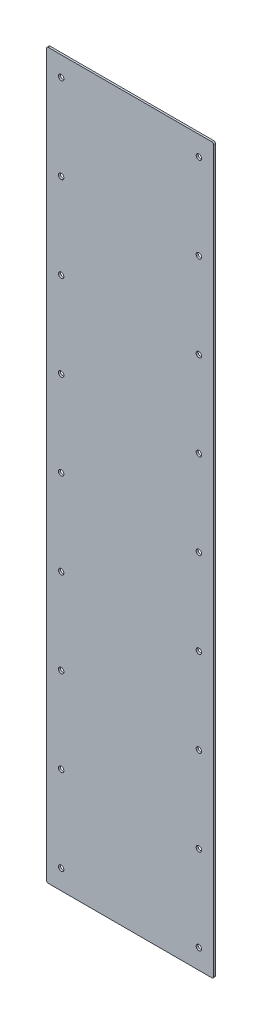
ISO-10303-21;
HEADER;
FILE_DESCRIPTION(('STEP AP214'),'2;1');
FILE_NAME('part.step','',(''),(''),'','','');
FILE_SCHEMA(('AUTOMOTIVE_DESIGN { 1 0 10303 214 1 1 1 1 }'));
ENDSEC;
DATA;
#1=APPLICATION_CONTEXT('core data for automotive mechanical design processes');
#2=APPLICATION_PROTOCOL_DEFINITION('international standard','automotive_design',2000,#1);
#3=PRODUCT_CONTEXT('',#1,'mechanical');
#4=PRODUCT('Part','Part','',(#3));
#5=PRODUCT_RELATED_PRODUCT_CATEGORY('part','',(#4));
#6=PRODUCT_DEFINITION_FORMATION('','',#4);
#7=PRODUCT_DEFINITION_CONTEXT('part definition',#1,'design');
#8=PRODUCT_DEFINITION('design','',#6,#7);
#9=PRODUCT_DEFINITION_SHAPE('','',#8);
#10=(LENGTH_UNIT() NAMED_UNIT(*) SI_UNIT(.MILLI.,.METRE.));
#11=(NAMED_UNIT(*) PLANE_ANGLE_UNIT() SI_UNIT($,.RADIAN.));
#12=(NAMED_UNIT(*) SI_UNIT($,.STERADIAN.) SOLID_ANGLE_UNIT());
#13=UNCERTAINTY_MEASURE_WITH_UNIT(LENGTH_MEASURE(1.E-05),#10,'distance_accuracy_value','');
#14=(GEOMETRIC_REPRESENTATION_CONTEXT(3) GLOBAL_UNCERTAINTY_ASSIGNED_CONTEXT((#13)) GLOBAL_UNIT_ASSIGNED_CONTEXT((#10,
#11,#12)) REPRESENTATION_CONTEXT('',''));
#15=CARTESIAN_POINT('',(0.,0.,0.));
#16=DIRECTION('',(0.,0.,1.));
#17=DIRECTION('',(1.,0.,0.));
#18=AXIS2_PLACEMENT_3D('',#15,#16,#17);
#19=CARTESIAN_POINT('',(0.,0.,-2.));
#20=DIRECTION('',(0.,0.,1.));
#21=DIRECTION('',(1.,0.,0.));
#22=AXIS2_PLACEMENT_3D('',#19,#20,#21);
#23=PLANE('',#22);
#24=CARTESIAN_POINT('',(-70.,-261.,-2.));
#25=DIRECTION('',(0.,0.,1.));
#26=DIRECTION('',(1.,0.,0.));
#27=AXIS2_PLACEMENT_3D('',#24,#25,#26);
#28=CIRCLE('',#27,2.74999999999999);
#29=CARTESIAN_POINT('',(-67.2500000000001,-261.,-2.));
#30=VERTEX_POINT('',#29);
#31=EDGE_CURVE('E292',#30,#30,#28,.T.);
#32=ORIENTED_EDGE('',*,*,#31,.T.);
#33=EDGE_LOOP('',(#32));
#34=FACE_BOUND('',#33,.T.);
#35=CARTESIAN_POINT('',(-70.0000000000001,-174.,-2.));
#36=DIRECTION('',(0.,0.,1.));
#37=DIRECTION('',(1.,0.,0.));
#38=AXIS2_PLACEMENT_3D('',#35,#36,#37);
#39=CIRCLE('',#38,2.74999999999999);
#40=CARTESIAN_POINT('',(-67.2500000000001,-174.,-2.));
#41=VERTEX_POINT('',#40);
#42=EDGE_CURVE('E286',#41,#41,#39,.T.);
#43=ORIENTED_EDGE('',*,*,#42,.T.);
#44=EDGE_LOOP('',(#43));
#45=FACE_BOUND('',#44,.T.);
#46=CARTESIAN_POINT('',(-70.0000000000001,-87.,-2.));
#47=DIRECTION('',(0.,0.,1.));
#48=DIRECTION('',(1.,0.,0.));
#49=AXIS2_PLACEMENT_3D('',#46,#47,#48);
#50=CIRCLE('',#49,2.74999999999999);
#51=CARTESIAN_POINT('',(-67.2500000000001,-87.,-2.));
#52=VERTEX_POINT('',#51);
#53=EDGE_CURVE('E280',#52,#52,#50,.T.);
#54=ORIENTED_EDGE('',*,*,#53,.T.);
#55=EDGE_LOOP('',(#54));
#56=FACE_BOUND('',#55,.T.);
#57=CARTESIAN_POINT('',(-70.0000000000001,0.,-2.));
#58=DIRECTION('',(0.,0.,1.));
#59=DIRECTION('',(1.,0.,0.));
#60=AXIS2_PLACEMENT_3D('',#57,#58,#59);
#61=CIRCLE('',#60,2.74999999999999);
#62=CARTESIAN_POINT('',(-67.2500000000001,0.,-2.));
#63=VERTEX_POINT('',#62);
#64=EDGE_CURVE('E274',#63,#63,#61,.T.);
#65=ORIENTED_EDGE('',*,*,#64,.T.);
#66=EDGE_LOOP('',(#65));
#67=FACE_BOUND('',#66,.T.);
#68=CARTESIAN_POINT('',(-70.0000000000001,87.,-2.));
#69=DIRECTION('',(0.,0.,1.));
#70=DIRECTION('',(1.,0.,0.));
#71=AXIS2_PLACEMENT_3D('',#68,#69,#70);
#72=CIRCLE('',#71,2.74999999999999);
#73=CARTESIAN_POINT('',(-67.2500000000001,87.,-2.));
#74=VERTEX_POINT('',#73);
#75=EDGE_CURVE('E268',#74,#74,#72,.T.);
#76=ORIENTED_EDGE('',*,*,#75,.T.);
#77=EDGE_LOOP('',(#76));
#78=FACE_BOUND('',#77,.T.);
#79=CARTESIAN_POINT('',(-70.0000000000001,174.,-2.));
#80=DIRECTION('',(0.,0.,1.));
#81=DIRECTION('',(1.,0.,0.));
#82=AXIS2_PLACEMENT_3D('',#79,#80,#81);
#83=CIRCLE('',#82,2.74999999999999);
#84=CARTESIAN_POINT('',(-67.2500000000001,174.,-2.));
#85=VERTEX_POINT('',#84);
#86=EDGE_CURVE('E262',#85,#85,#83,.T.);
#87=ORIENTED_EDGE('',*,*,#86,.T.);
#88=EDGE_LOOP('',(#87));
#89=FACE_BOUND('',#88,.T.);
#90=CARTESIAN_POINT('',(-70.0000000000001,261.,-2.));
#91=DIRECTION('',(0.,0.,1.));
#92=DIRECTION('',(1.,0.,0.));
#93=AXIS2_PLACEMENT_3D('',#90,#91,#92);
#94=CIRCLE('',#93,2.74999999999999);
#95=CARTESIAN_POINT('',(-67.2500000000001,261.,-2.));
#96=VERTEX_POINT('',#95);
#97=EDGE_CURVE('E255',#96,#96,#94,.T.);
#98=ORIENTED_EDGE('',*,*,#97,.T.);
#99=EDGE_LOOP('',(#98));
#100=FACE_BOUND('',#99,.T.);
#101=CARTESIAN_POINT('',(-70.0000000000001,348.,-2.));
#102=DIRECTION('',(0.,0.,1.));
#103=DIRECTION('',(1.,0.,0.));
#104=AXIS2_PLACEMENT_3D('',#101,#102,#103);
#105=CIRCLE('',#104,2.74999999999999);
#106=CARTESIAN_POINT('',(-67.2500000000001,348.,-2.));
#107=VERTEX_POINT('',#106);
#108=EDGE_CURVE('E256',#107,#107,#105,.T.);
#109=ORIENTED_EDGE('',*,*,#108,.T.);
#110=EDGE_LOOP('',(#109));
#111=FACE_BOUND('',#110,.T.);
#112=CARTESIAN_POINT('',(70.,-261.,-2.));
#113=DIRECTION('',(0.,0.,-1.));
#114=DIRECTION('',(-1.,0.,0.));
#115=AXIS2_PLACEMENT_3D('',#112,#113,#114);
#116=CIRCLE('',#115,2.74999999999999);
#117=CARTESIAN_POINT('',(67.2500000000001,-261.,-2.));
#118=VERTEX_POINT('',#117);
#119=EDGE_CURVE('E239',#118,#118,#116,.T.);
#120=ORIENTED_EDGE('',*,*,#119,.F.);
#121=EDGE_LOOP('',(#120));
#122=FACE_BOUND('',#121,.T.);
#123=CARTESIAN_POINT('',(70.0000000000001,-174.,-2.));
#124=DIRECTION('',(0.,0.,-1.));
#125=DIRECTION('',(-1.,0.,0.));
#126=AXIS2_PLACEMENT_3D('',#123,#124,#125);
#127=CIRCLE('',#126,2.74999999999999);
#128=CARTESIAN_POINT('',(67.2500000000001,-174.,-2.));
#129=VERTEX_POINT('',#128);
#130=EDGE_CURVE('E233',#129,#129,#127,.T.);
#131=ORIENTED_EDGE('',*,*,#130,.F.);
#132=EDGE_LOOP('',(#131));
#133=FACE_BOUND('',#132,.T.);
#134=CARTESIAN_POINT('',(70.0000000000001,-87.,-2.));
#135=DIRECTION('',(0.,0.,-1.));
#136=DIRECTION('',(-1.,0.,0.));
#137=AXIS2_PLACEMENT_3D('',#134,#135,#136);
#138=CIRCLE('',#137,2.74999999999999);
#139=CARTESIAN_POINT('',(67.2500000000001,-87.,-2.));
#140=VERTEX_POINT('',#139);
#141=EDGE_CURVE('E227',#140,#140,#138,.T.);
#142=ORIENTED_EDGE('',*,*,#141,.F.);
#143=EDGE_LOOP('',(#142));
#144=FACE_BOUND('',#143,.T.);
#145=CARTESIAN_POINT('',(70.0000000000001,0.,-2.));
#146=DIRECTION('',(0.,0.,-1.));
#147=DIRECTION('',(-1.,0.,0.));
#148=AXIS2_PLACEMENT_3D('',#145,#146,#147);
#149=CIRCLE('',#148,2.74999999999999);
#150=CARTESIAN_POINT('',(67.2500000000001,0.,-2.));
#151=VERTEX_POINT('',#150);
#152=EDGE_CURVE('E221',#151,#151,#149,.T.);
#153=ORIENTED_EDGE('',*,*,#152,.F.);
#154=EDGE_LOOP('',(#153));
#155=FACE_BOUND('',#154,.T.);
#156=CARTESIAN_POINT('',(70.0000000000001,87.,-2.));
#157=DIRECTION('',(0.,0.,-1.));
#158=DIRECTION('',(-1.,0.,0.));
#159=AXIS2_PLACEMENT_3D('',#156,#157,#158);
#160=CIRCLE('',#159,2.74999999999999);
#161=CARTESIAN_POINT('',(67.2500000000001,87.,-2.));
#162=VERTEX_POINT('',#161);
#163=EDGE_CURVE('E215',#162,#162,#160,.T.);
#164=ORIENTED_EDGE('',*,*,#163,.F.);
#165=EDGE_LOOP('',(#164));
#166=FACE_BOUND('',#165,.T.);
#167=CARTESIAN_POINT('',(70.0000000000001,174.,-2.));
#168=DIRECTION('',(0.,0.,-1.));
#169=DIRECTION('',(-1.,0.,0.));
#170=AXIS2_PLACEMENT_3D('',#167,#168,#169);
#171=CIRCLE('',#170,2.74999999999999);
#172=CARTESIAN_POINT('',(67.2500000000001,174.,-2.));
#173=VERTEX_POINT('',#172);
#174=EDGE_CURVE('E209',#173,#173,#171,.T.);
#175=ORIENTED_EDGE('',*,*,#174,.F.);
#176=EDGE_LOOP('',(#175));
#177=FACE_BOUND('',#176,.T.);
#178=CARTESIAN_POINT('',(70.0000000000001,261.,-2.));
#179=DIRECTION('',(0.,0.,-1.));
#180=DIRECTION('',(-1.,0.,0.));
#181=AXIS2_PLACEMENT_3D('',#178,#179,#180);
#182=CIRCLE('',#181,2.74999999999999);
#183=CARTESIAN_POINT('',(67.2500000000001,261.,-2.));
#184=VERTEX_POINT('',#183);
#185=EDGE_CURVE('E201',#184,#184,#182,.T.);
#186=ORIENTED_EDGE('',*,*,#185,.F.);
#187=EDGE_LOOP('',(#186));
#188=FACE_BOUND('',#187,.T.);
#189=CARTESIAN_POINT('',(70.0000000000001,348.,-2.));
#190=DIRECTION('',(0.,0.,-1.));
#191=DIRECTION('',(-1.,0.,0.));
#192=AXIS2_PLACEMENT_3D('',#189,#190,#191);
#193=CIRCLE('',#192,2.74999999999999);
#194=CARTESIAN_POINT('',(67.2500000000001,348.,-2.));
#195=VERTEX_POINT('',#194);
#196=EDGE_CURVE('E202',#195,#195,#193,.T.);
#197=ORIENTED_EDGE('',*,*,#196,.F.);
#198=EDGE_LOOP('',(#197));
#199=FACE_BOUND('',#198,.T.);
#200=CARTESIAN_POINT('',(70.,-348.,-2.));
#201=DIRECTION('',(0.,0.,-1.));
#202=DIRECTION('',(-1.,0.,0.));
#203=AXIS2_PLACEMENT_3D('',#200,#201,#202);
#204=CIRCLE('',#203,2.74999999999999);
#205=CARTESIAN_POINT('',(67.25,-348.,-2.));
#206=VERTEX_POINT('',#205);
#207=EDGE_CURVE('E194',#206,#206,#204,.T.);
#208=ORIENTED_EDGE('',*,*,#207,.F.);
#209=EDGE_LOOP('',(#208));
#210=FACE_BOUND('',#209,.T.);
#211=DIRECTION('',(0.,-1.,0.));
#212=VECTOR('',#211,1.);
#213=CARTESIAN_POINT('',(-85.,-368.,-2.));
#214=LINE('',#213,#212);
#215=CARTESIAN_POINT('',(-85.,366.,-2.));
#216=VERTEX_POINT('',#215);
#217=CARTESIAN_POINT('',(-85.,-366.,-2.));
#218=VERTEX_POINT('',#217);
#219=EDGE_CURVE('E133',#216,#218,#214,.T.);
#220=ORIENTED_EDGE('',*,*,#219,.F.);
#221=CARTESIAN_POINT('',(-83.,366.,-2.));
#222=DIRECTION('',(0.,0.,1.));
#223=DIRECTION('',(1.,0.,0.));
#224=AXIS2_PLACEMENT_3D('',#221,#222,#223);
#225=CIRCLE('',#224,2.);
#226=CARTESIAN_POINT('',(-83.,368.,-2.));
#227=VERTEX_POINT('',#226);
#228=EDGE_CURVE('E158',#216,#227,#225,.F.);
#229=ORIENTED_EDGE('',*,*,#228,.T.);
#230=DIRECTION('',(-1.,0.,0.));
#231=VECTOR('',#230,1.);
#232=CARTESIAN_POINT('',(85.,368.,-2.));
#233=LINE('',#232,#231);
#234=CARTESIAN_POINT('',(83.,368.,-2.));
#235=VERTEX_POINT('',#234);
#236=EDGE_CURVE('E138',#235,#227,#233,.T.);
#237=ORIENTED_EDGE('',*,*,#236,.F.);
#238=CARTESIAN_POINT('',(83.,366.,-2.));
#239=DIRECTION('',(0.,0.,1.));
#240=DIRECTION('',(1.,0.,0.));
#241=AXIS2_PLACEMENT_3D('',#238,#239,#240);
#242=CIRCLE('',#241,2.);
#243=CARTESIAN_POINT('',(85.,366.,-2.));
#244=VERTEX_POINT('',#243);
#245=EDGE_CURVE('E137',#235,#244,#242,.F.);
#246=ORIENTED_EDGE('',*,*,#245,.T.);
#247=DIRECTION('',(0.,1.,0.));
#248=VECTOR('',#247,1.);
#249=CARTESIAN_POINT('',(85.,-368.,-2.));
#250=LINE('',#249,#248);
#251=CARTESIAN_POINT('',(85.,-366.,-2.));
#252=VERTEX_POINT('',#251);
#253=EDGE_CURVE('E142',#252,#244,#250,.T.);
#254=ORIENTED_EDGE('',*,*,#253,.F.);
#255=CARTESIAN_POINT('',(83.,-366.,-2.));
#256=DIRECTION('',(0.,0.,1.));
#257=DIRECTION('',(1.,0.,0.));
#258=AXIS2_PLACEMENT_3D('',#255,#256,#257);
#259=CIRCLE('',#258,2.);
#260=CARTESIAN_POINT('',(83.,-368.,-2.));
#261=VERTEX_POINT('',#260);
#262=EDGE_CURVE('E61',#252,#261,#259,.F.);
#263=ORIENTED_EDGE('',*,*,#262,.T.);
#264=DIRECTION('',(1.,0.,0.));
#265=VECTOR('',#264,1.);
#266=CARTESIAN_POINT('',(85.,-368.,-2.));
#267=LINE('',#266,#265);
#268=CARTESIAN_POINT('',(-83.,-368.,-2.));
#269=VERTEX_POINT('',#268);
#270=EDGE_CURVE('E167',#269,#261,#267,.T.);
#271=ORIENTED_EDGE('',*,*,#270,.F.);
#272=CARTESIAN_POINT('',(-83.,-366.,-2.));
#273=DIRECTION('',(0.,0.,1.));
#274=DIRECTION('',(1.,0.,0.));
#275=AXIS2_PLACEMENT_3D('',#272,#273,#274);
#276=CIRCLE('',#275,2.);
#277=EDGE_CURVE('E154',#269,#218,#276,.F.);
#278=ORIENTED_EDGE('',*,*,#277,.T.);
#279=EDGE_LOOP('',(#220,#229,#237,#246,#254,#263,#271,#278));
#280=FACE_BOUND('',#279,.T.);
#281=CARTESIAN_POINT('',(-70.,-348.,-2.));
#282=DIRECTION('',(0.,0.,-1.));
#283=DIRECTION('',(-1.,0.,0.));
#284=AXIS2_PLACEMENT_3D('',#281,#282,#283);
#285=CIRCLE('',#284,2.74999999999999);
#286=CARTESIAN_POINT('',(-72.75,-348.,-2.));
#287=VERTEX_POINT('',#286);
#288=EDGE_CURVE('E248',#287,#287,#285,.T.);
#289=ORIENTED_EDGE('',*,*,#288,.F.);
#290=EDGE_LOOP('',(#289));
#291=FACE_BOUND('',#290,.T.);
#292=ADVANCED_FACE('F46',(#34,#45,#56,#67,#78,#89,#100,#111,#122,#133,#144,#155,#166,#177,#188,
#199,#210,#280,#291),#23,.F.);
#293=CARTESIAN_POINT('',(-85.,-368.,-2.));
#294=DIRECTION('',(-1.,0.,0.));
#295=DIRECTION('',(0.,0.,1.));
#296=AXIS2_PLACEMENT_3D('',#293,#294,#295);
#297=PLANE('',#296);
#298=DIRECTION('',(0.,-1.,0.));
#299=VECTOR('',#298,1.);
#300=CARTESIAN_POINT('',(-85.,-368.,0.));
#301=LINE('',#300,#299);
#302=CARTESIAN_POINT('',(-85.,366.,0.));
#303=VERTEX_POINT('',#302);
#304=CARTESIAN_POINT('',(-85.,-366.,0.));
#305=VERTEX_POINT('',#304);
#306=EDGE_CURVE('E172',#303,#305,#301,.T.);
#307=ORIENTED_EDGE('',*,*,#306,.F.);
#308=DIRECTION('',(0.,0.,1.));
#309=VECTOR('',#308,1.);
#310=CARTESIAN_POINT('',(-85.,366.,-2.));
#311=LINE('',#310,#309);
#312=EDGE_CURVE('E152',#303,#216,#311,.F.);
#313=ORIENTED_EDGE('',*,*,#312,.T.);
#314=ORIENTED_EDGE('',*,*,#219,.T.);
#315=DIRECTION('',(0.,0.,1.));
#316=VECTOR('',#315,1.);
#317=CARTESIAN_POINT('',(-85.,-366.,-2.));
#318=LINE('',#317,#316);
#319=EDGE_CURVE('E149',#218,#305,#318,.T.);
#320=ORIENTED_EDGE('',*,*,#319,.T.);
#321=EDGE_LOOP('',(#307,#313,#314,#320));
#322=FACE_BOUND('',#321,.T.);
#323=ADVANCED_FACE('F189',(#322),#297,.T.);
#324=CARTESIAN_POINT('',(85.,368.,-2.));
#325=DIRECTION('',(0.,1.,0.));
#326=DIRECTION('',(0.,0.,1.));
#327=AXIS2_PLACEMENT_3D('',#324,#325,#326);
#328=PLANE('',#327);
#329=ORIENTED_EDGE('',*,*,#236,.T.);
#330=DIRECTION('',(0.,0.,1.));
#331=VECTOR('',#330,1.);
#332=CARTESIAN_POINT('',(-83.,368.,-2.));
#333=LINE('',#332,#331);
#334=CARTESIAN_POINT('',(-83.,368.,0.));
#335=VERTEX_POINT('',#334);
#336=EDGE_CURVE('E132',#227,#335,#333,.T.);
#337=ORIENTED_EDGE('',*,*,#336,.T.);
#338=DIRECTION('',(-1.,0.,0.));
#339=VECTOR('',#338,1.);
#340=CARTESIAN_POINT('',(85.,368.,0.));
#341=LINE('',#340,#339);
#342=CARTESIAN_POINT('',(83.,368.,0.));
#343=VERTEX_POINT('',#342);
#344=EDGE_CURVE('E115',#343,#335,#341,.T.);
#345=ORIENTED_EDGE('',*,*,#344,.F.);
#346=DIRECTION('',(0.,0.,1.));
#347=VECTOR('',#346,1.);
#348=CARTESIAN_POINT('',(83.,368.,-2.));
#349=LINE('',#348,#347);
#350=EDGE_CURVE('E129',#343,#235,#349,.F.);
#351=ORIENTED_EDGE('',*,*,#350,.T.);
#352=EDGE_LOOP('',(#329,#337,#345,#351));
#353=FACE_BOUND('',#352,.T.);
#354=ADVANCED_FACE('F128',(#353),#328,.T.);
#355=CARTESIAN_POINT('',(85.,-368.,-2.));
#356=DIRECTION('',(1.,0.,0.));
#357=DIRECTION('',(0.,0.,-1.));
#358=AXIS2_PLACEMENT_3D('',#355,#356,#357);
#359=PLANE('',#358);
#360=ORIENTED_EDGE('',*,*,#253,.T.);
#361=DIRECTION('',(0.,0.,1.));
#362=VECTOR('',#361,1.);
#363=CARTESIAN_POINT('',(85.,366.,-2.));
#364=LINE('',#363,#362);
#365=CARTESIAN_POINT('',(85.,366.,0.));
#366=VERTEX_POINT('',#365);
#367=EDGE_CURVE('E162',#244,#366,#364,.T.);
#368=ORIENTED_EDGE('',*,*,#367,.T.);
#369=DIRECTION('',(0.,1.,0.));
#370=VECTOR('',#369,1.);
#371=CARTESIAN_POINT('',(85.,-368.,0.));
#372=LINE('',#371,#370);
#373=CARTESIAN_POINT('',(85.,-366.,0.));
#374=VERTEX_POINT('',#373);
#375=EDGE_CURVE('E117',#374,#366,#372,.T.);
#376=ORIENTED_EDGE('',*,*,#375,.F.);
#377=DIRECTION('',(0.,0.,1.));
#378=VECTOR('',#377,1.);
#379=CARTESIAN_POINT('',(85.,-366.,-2.));
#380=LINE('',#379,#378);
#381=EDGE_CURVE('E160',#374,#252,#380,.F.);
#382=ORIENTED_EDGE('',*,*,#381,.T.);
#383=EDGE_LOOP('',(#360,#368,#376,#382));
#384=FACE_BOUND('',#383,.T.);
#385=ADVANCED_FACE('F165',(#384),#359,.T.);
#386=CARTESIAN_POINT('',(85.,-368.,-2.));
#387=DIRECTION('',(0.,-1.,0.));
#388=DIRECTION('',(1.,0.,0.));
#389=AXIS2_PLACEMENT_3D('',#386,#387,#388);
#390=PLANE('',#389);
#391=ORIENTED_EDGE('',*,*,#270,.T.);
#392=DIRECTION('',(0.,0.,1.));
#393=VECTOR('',#392,1.);
#394=CARTESIAN_POINT('',(83.,-368.,-2.));
#395=LINE('',#394,#393);
#396=CARTESIAN_POINT('',(83.,-368.,0.));
#397=VERTEX_POINT('',#396);
#398=EDGE_CURVE('E12',#261,#397,#395,.T.);
#399=ORIENTED_EDGE('',*,*,#398,.T.);
#400=DIRECTION('',(1.,0.,0.));
#401=VECTOR('',#400,1.);
#402=CARTESIAN_POINT('',(85.,-368.,0.));
#403=LINE('',#402,#401);
#404=CARTESIAN_POINT('',(-83.,-368.,0.));
#405=VERTEX_POINT('',#404);
#406=EDGE_CURVE('E175',#405,#397,#403,.T.);
#407=ORIENTED_EDGE('',*,*,#406,.F.);
#408=DIRECTION('',(0.,0.,1.));
#409=VECTOR('',#408,1.);
#410=CARTESIAN_POINT('',(-83.,-368.,-2.));
#411=LINE('',#410,#409);
#412=EDGE_CURVE('E54',#405,#269,#411,.F.);
#413=ORIENTED_EDGE('',*,*,#412,.T.);
#414=EDGE_LOOP('',(#391,#399,#407,#413));
#415=FACE_BOUND('',#414,.T.);
#416=ADVANCED_FACE('F178',(#415),#390,.T.);
#417=CARTESIAN_POINT('',(0.,0.,0.));
#418=DIRECTION('',(0.,0.,1.));
#419=DIRECTION('',(1.,0.,0.));
#420=AXIS2_PLACEMENT_3D('',#417,#418,#419);
#421=PLANE('',#420);
#422=CARTESIAN_POINT('',(-70.,-261.,0.));
#423=DIRECTION('',(0.,0.,-1.));
#424=DIRECTION('',(-1.,0.,0.));
#425=AXIS2_PLACEMENT_3D('',#422,#423,#424);
#426=CIRCLE('',#425,2.75);
#427=CARTESIAN_POINT('',(-72.75,-261.,0.));
#428=VERTEX_POINT('',#427);
#429=EDGE_CURVE('E251',#428,#428,#426,.T.);
#430=ORIENTED_EDGE('',*,*,#429,.T.);
#431=EDGE_LOOP('',(#430));
#432=FACE_BOUND('',#431,.T.);
#433=CARTESIAN_POINT('',(-70.0000000000001,-174.,0.));
#434=DIRECTION('',(0.,0.,-1.));
#435=DIRECTION('',(-1.,0.,0.));
#436=AXIS2_PLACEMENT_3D('',#433,#434,#435);
#437=CIRCLE('',#436,2.75);
#438=CARTESIAN_POINT('',(-72.7500000000001,-174.,0.));
#439=VERTEX_POINT('',#438);
#440=EDGE_CURVE('E289',#439,#439,#437,.T.);
#441=ORIENTED_EDGE('',*,*,#440,.T.);
#442=EDGE_LOOP('',(#441));
#443=FACE_BOUND('',#442,.T.);
#444=CARTESIAN_POINT('',(-70.0000000000001,-87.,0.));
#445=DIRECTION('',(0.,0.,-1.));
#446=DIRECTION('',(-1.,0.,0.));
#447=AXIS2_PLACEMENT_3D('',#444,#445,#446);
#448=CIRCLE('',#447,2.75);
#449=CARTESIAN_POINT('',(-72.7500000000001,-87.,0.));
#450=VERTEX_POINT('',#449);
#451=EDGE_CURVE('E283',#450,#450,#448,.T.);
#452=ORIENTED_EDGE('',*,*,#451,.T.);
#453=EDGE_LOOP('',(#452));
#454=FACE_BOUND('',#453,.T.);
#455=CARTESIAN_POINT('',(-70.0000000000001,0.,0.));
#456=DIRECTION('',(0.,0.,-1.));
#457=DIRECTION('',(-1.,0.,0.));
#458=AXIS2_PLACEMENT_3D('',#455,#456,#457);
#459=CIRCLE('',#458,2.75);
#460=CARTESIAN_POINT('',(-72.7500000000001,0.,0.));
#461=VERTEX_POINT('',#460);
#462=EDGE_CURVE('E277',#461,#461,#459,.T.);
#463=ORIENTED_EDGE('',*,*,#462,.T.);
#464=EDGE_LOOP('',(#463));
#465=FACE_BOUND('',#464,.T.);
#466=CARTESIAN_POINT('',(-70.0000000000001,87.,0.));
#467=DIRECTION('',(0.,0.,-1.));
#468=DIRECTION('',(-1.,0.,0.));
#469=AXIS2_PLACEMENT_3D('',#466,#467,#468);
#470=CIRCLE('',#469,2.75);
#471=CARTESIAN_POINT('',(-72.7500000000001,87.,0.));
#472=VERTEX_POINT('',#471);
#473=EDGE_CURVE('E271',#472,#472,#470,.T.);
#474=ORIENTED_EDGE('',*,*,#473,.T.);
#475=EDGE_LOOP('',(#474));
#476=FACE_BOUND('',#475,.T.);
#477=CARTESIAN_POINT('',(-70.0000000000001,174.,0.));
#478=DIRECTION('',(0.,0.,-1.));
#479=DIRECTION('',(-1.,0.,0.));
#480=AXIS2_PLACEMENT_3D('',#477,#478,#479);
#481=CIRCLE('',#480,2.75);
#482=CARTESIAN_POINT('',(-72.7500000000001,174.,0.));
#483=VERTEX_POINT('',#482);
#484=EDGE_CURVE('E265',#483,#483,#481,.T.);
#485=ORIENTED_EDGE('',*,*,#484,.T.);
#486=EDGE_LOOP('',(#485));
#487=FACE_BOUND('',#486,.T.);
#488=CARTESIAN_POINT('',(-70.0000000000001,261.,0.));
#489=DIRECTION('',(0.,0.,-1.));
#490=DIRECTION('',(-1.,0.,0.));
#491=AXIS2_PLACEMENT_3D('',#488,#489,#490);
#492=CIRCLE('',#491,2.75);
#493=CARTESIAN_POINT('',(-72.7500000000001,261.,0.));
#494=VERTEX_POINT('',#493);
#495=EDGE_CURVE('E259',#494,#494,#492,.T.);
#496=ORIENTED_EDGE('',*,*,#495,.T.);
#497=EDGE_LOOP('',(#496));
#498=FACE_BOUND('',#497,.T.);
#499=CARTESIAN_POINT('',(-70.0000000000001,348.,0.));
#500=DIRECTION('',(0.,0.,-1.));
#501=DIRECTION('',(-1.,0.,0.));
#502=AXIS2_PLACEMENT_3D('',#499,#500,#501);
#503=CIRCLE('',#502,2.75);
#504=CARTESIAN_POINT('',(-72.7500000000001,348.,0.));
#505=VERTEX_POINT('',#504);
#506=EDGE_CURVE('E252',#505,#505,#503,.T.);
#507=ORIENTED_EDGE('',*,*,#506,.T.);
#508=EDGE_LOOP('',(#507));
#509=FACE_BOUND('',#508,.T.);
#510=CARTESIAN_POINT('',(-70.,-348.,0.));
#511=DIRECTION('',(0.,0.,1.));
#512=DIRECTION('',(1.,0.,0.));
#513=AXIS2_PLACEMENT_3D('',#510,#511,#512);
#514=CIRCLE('',#513,2.75);
#515=CARTESIAN_POINT('',(-67.25,-348.,0.));
#516=VERTEX_POINT('',#515);
#517=EDGE_CURVE('E205',#516,#516,#514,.T.);
#518=ORIENTED_EDGE('',*,*,#517,.F.);
#519=EDGE_LOOP('',(#518));
#520=FACE_BOUND('',#519,.T.);
#521=CARTESIAN_POINT('',(70.,-261.,0.));
#522=DIRECTION('',(0.,0.,1.));
#523=DIRECTION('',(1.,0.,0.));
#524=AXIS2_PLACEMENT_3D('',#521,#522,#523);
#525=CIRCLE('',#524,2.75);
#526=CARTESIAN_POINT('',(72.75,-261.,0.));
#527=VERTEX_POINT('',#526);
#528=EDGE_CURVE('E197',#527,#527,#525,.T.);
#529=ORIENTED_EDGE('',*,*,#528,.F.);
#530=EDGE_LOOP('',(#529));
#531=FACE_BOUND('',#530,.T.);
#532=CARTESIAN_POINT('',(70.0000000000001,-174.,0.));
#533=DIRECTION('',(0.,0.,1.));
#534=DIRECTION('',(1.,0.,0.));
#535=AXIS2_PLACEMENT_3D('',#532,#533,#534);
#536=CIRCLE('',#535,2.75);
#537=CARTESIAN_POINT('',(72.7500000000001,-174.,0.));
#538=VERTEX_POINT('',#537);
#539=EDGE_CURVE('E236',#538,#538,#536,.T.);
#540=ORIENTED_EDGE('',*,*,#539,.F.);
#541=EDGE_LOOP('',(#540));
#542=FACE_BOUND('',#541,.T.);
#543=CARTESIAN_POINT('',(70.0000000000001,-87.,0.));
#544=DIRECTION('',(0.,0.,1.));
#545=DIRECTION('',(1.,0.,0.));
#546=AXIS2_PLACEMENT_3D('',#543,#544,#545);
#547=CIRCLE('',#546,2.75);
#548=CARTESIAN_POINT('',(72.7500000000001,-87.,0.));
#549=VERTEX_POINT('',#548);
#550=EDGE_CURVE('E230',#549,#549,#547,.T.);
#551=ORIENTED_EDGE('',*,*,#550,.F.);
#552=EDGE_LOOP('',(#551));
#553=FACE_BOUND('',#552,.T.);
#554=CARTESIAN_POINT('',(70.0000000000001,0.,0.));
#555=DIRECTION('',(0.,0.,1.));
#556=DIRECTION('',(1.,0.,0.));
#557=AXIS2_PLACEMENT_3D('',#554,#555,#556);
#558=CIRCLE('',#557,2.75);
#559=CARTESIAN_POINT('',(72.7500000000001,0.,0.));
#560=VERTEX_POINT('',#559);
#561=EDGE_CURVE('E224',#560,#560,#558,.T.);
#562=ORIENTED_EDGE('',*,*,#561,.F.);
#563=EDGE_LOOP('',(#562));
#564=FACE_BOUND('',#563,.T.);
#565=CARTESIAN_POINT('',(70.0000000000001,87.,0.));
#566=DIRECTION('',(0.,0.,1.));
#567=DIRECTION('',(1.,0.,0.));
#568=AXIS2_PLACEMENT_3D('',#565,#566,#567);
#569=CIRCLE('',#568,2.75);
#570=CARTESIAN_POINT('',(72.7500000000001,87.,0.));
#571=VERTEX_POINT('',#570);
#572=EDGE_CURVE('E218',#571,#571,#569,.T.);
#573=ORIENTED_EDGE('',*,*,#572,.F.);
#574=EDGE_LOOP('',(#573));
#575=FACE_BOUND('',#574,.T.);
#576=CARTESIAN_POINT('',(70.0000000000001,174.,0.));
#577=DIRECTION('',(0.,0.,1.));
#578=DIRECTION('',(1.,0.,0.));
#579=AXIS2_PLACEMENT_3D('',#576,#577,#578);
#580=CIRCLE('',#579,2.75);
#581=CARTESIAN_POINT('',(72.7500000000001,174.,0.));
#582=VERTEX_POINT('',#581);
#583=EDGE_CURVE('E212',#582,#582,#580,.T.);
#584=ORIENTED_EDGE('',*,*,#583,.F.);
#585=EDGE_LOOP('',(#584));
#586=FACE_BOUND('',#585,.T.);
#587=CARTESIAN_POINT('',(70.0000000000001,261.,0.));
#588=DIRECTION('',(0.,0.,1.));
#589=DIRECTION('',(1.,0.,0.));
#590=AXIS2_PLACEMENT_3D('',#587,#588,#589);
#591=CIRCLE('',#590,2.75);
#592=CARTESIAN_POINT('',(72.7500000000001,261.,0.));
#593=VERTEX_POINT('',#592);
#594=EDGE_CURVE('E206',#593,#593,#591,.T.);
#595=ORIENTED_EDGE('',*,*,#594,.F.);
#596=EDGE_LOOP('',(#595));
#597=FACE_BOUND('',#596,.T.);
#598=CARTESIAN_POINT('',(70.0000000000001,348.,0.));
#599=DIRECTION('',(0.,0.,1.));
#600=DIRECTION('',(1.,0.,0.));
#601=AXIS2_PLACEMENT_3D('',#598,#599,#600);
#602=CIRCLE('',#601,2.75);
#603=CARTESIAN_POINT('',(72.7500000000001,348.,0.));
#604=VERTEX_POINT('',#603);
#605=EDGE_CURVE('E198',#604,#604,#602,.T.);
#606=ORIENTED_EDGE('',*,*,#605,.F.);
#607=EDGE_LOOP('',(#606));
#608=FACE_BOUND('',#607,.T.);
#609=CARTESIAN_POINT('',(70.,-348.,0.));
#610=DIRECTION('',(0.,0.,1.));
#611=DIRECTION('',(1.,0.,0.));
#612=AXIS2_PLACEMENT_3D('',#609,#610,#611);
#613=CIRCLE('',#612,2.75);
#614=CARTESIAN_POINT('',(72.75,-348.,0.));
#615=VERTEX_POINT('',#614);
#616=EDGE_CURVE('E176',#615,#615,#613,.T.);
#617=ORIENTED_EDGE('',*,*,#616,.F.);
#618=EDGE_LOOP('',(#617));
#619=FACE_BOUND('',#618,.T.);
#620=ORIENTED_EDGE('',*,*,#344,.T.);
#621=CARTESIAN_POINT('',(-83.,366.,0.));
#622=DIRECTION('',(0.,0.,1.));
#623=DIRECTION('',(1.,0.,0.));
#624=AXIS2_PLACEMENT_3D('',#621,#622,#623);
#625=CIRCLE('',#624,2.);
#626=EDGE_CURVE('E122',#335,#303,#625,.T.);
#627=ORIENTED_EDGE('',*,*,#626,.T.);
#628=ORIENTED_EDGE('',*,*,#306,.T.);
#629=CARTESIAN_POINT('',(-83.,-366.,0.));
#630=DIRECTION('',(0.,0.,1.));
#631=DIRECTION('',(1.,0.,0.));
#632=AXIS2_PLACEMENT_3D('',#629,#630,#631);
#633=CIRCLE('',#632,2.);
#634=EDGE_CURVE('E140',#305,#405,#633,.T.);
#635=ORIENTED_EDGE('',*,*,#634,.T.);
#636=ORIENTED_EDGE('',*,*,#406,.T.);
#637=CARTESIAN_POINT('',(83.,-366.,0.));
#638=DIRECTION('',(0.,0.,1.));
#639=DIRECTION('',(1.,0.,0.));
#640=AXIS2_PLACEMENT_3D('',#637,#638,#639);
#641=CIRCLE('',#640,2.);
#642=EDGE_CURVE('E123',#397,#374,#641,.T.);
#643=ORIENTED_EDGE('',*,*,#642,.T.);
#644=ORIENTED_EDGE('',*,*,#375,.T.);
#645=CARTESIAN_POINT('',(83.,366.,0.));
#646=DIRECTION('',(0.,0.,1.));
#647=DIRECTION('',(1.,0.,0.));
#648=AXIS2_PLACEMENT_3D('',#645,#646,#647);
#649=CIRCLE('',#648,2.);
#650=EDGE_CURVE('E112',#366,#343,#649,.T.);
#651=ORIENTED_EDGE('',*,*,#650,.T.);
#652=EDGE_LOOP('',(#620,#627,#628,#635,#636,#643,#644,#651));
#653=FACE_BOUND('',#652,.T.);
#654=ADVANCED_FACE('F114',(#432,#443,#454,#465,#476,#487,#498,#509,#520,#531,#542,#553,#564,
#575,#586,#597,#608,#619,#653),#421,.T.);
#655=CARTESIAN_POINT('',(70.,-348.,-2.));
#656=DIRECTION('',(0.,0.,-1.));
#657=DIRECTION('',(-1.,0.,0.));
#658=AXIS2_PLACEMENT_3D('',#655,#656,#657);
#659=CYLINDRICAL_SURFACE('',#658,2.75);
#660=ORIENTED_EDGE('',*,*,#207,.T.);
#661=EDGE_LOOP('',(#660));
#662=FACE_BOUND('',#661,.T.);
#663=ORIENTED_EDGE('',*,*,#616,.T.);
#664=EDGE_LOOP('',(#663));
#665=FACE_BOUND('',#664,.T.);
#666=ADVANCED_FACE('F312',(#662,#665),#659,.F.);
#667=CARTESIAN_POINT('',(70.0000000000001,348.,-2.));
#668=DIRECTION('',(0.,0.,-1.));
#669=DIRECTION('',(-1.,0.,0.));
#670=AXIS2_PLACEMENT_3D('',#667,#668,#669);
#671=CYLINDRICAL_SURFACE('',#670,2.75);
#672=ORIENTED_EDGE('',*,*,#196,.T.);
#673=EDGE_LOOP('',(#672));
#674=FACE_BOUND('',#673,.T.);
#675=ORIENTED_EDGE('',*,*,#605,.T.);
#676=EDGE_LOOP('',(#675));
#677=FACE_BOUND('',#676,.T.);
#678=ADVANCED_FACE('F349',(#674,#677),#671,.F.);
#679=CARTESIAN_POINT('',(70.0000000000001,261.,-2.));
#680=DIRECTION('',(0.,0.,-1.));
#681=DIRECTION('',(-1.,0.,0.));
#682=AXIS2_PLACEMENT_3D('',#679,#680,#681);
#683=CYLINDRICAL_SURFACE('',#682,2.75);
#684=ORIENTED_EDGE('',*,*,#185,.T.);
#685=EDGE_LOOP('',(#684));
#686=FACE_BOUND('',#685,.T.);
#687=ORIENTED_EDGE('',*,*,#594,.T.);
#688=EDGE_LOOP('',(#687));
#689=FACE_BOUND('',#688,.T.);
#690=ADVANCED_FACE('F355',(#686,#689),#683,.F.);
#691=CARTESIAN_POINT('',(70.0000000000001,174.,-2.));
#692=DIRECTION('',(0.,0.,-1.));
#693=DIRECTION('',(-1.,0.,0.));
#694=AXIS2_PLACEMENT_3D('',#691,#692,#693);
#695=CYLINDRICAL_SURFACE('',#694,2.75);
#696=ORIENTED_EDGE('',*,*,#174,.T.);
#697=EDGE_LOOP('',(#696));
#698=FACE_BOUND('',#697,.T.);
#699=ORIENTED_EDGE('',*,*,#583,.T.);
#700=EDGE_LOOP('',(#699));
#701=FACE_BOUND('',#700,.T.);
#702=ADVANCED_FACE('F593',(#698,#701),#695,.F.);
#703=CARTESIAN_POINT('',(70.0000000000001,87.,-2.));
#704=DIRECTION('',(0.,0.,-1.));
#705=DIRECTION('',(-1.,0.,0.));
#706=AXIS2_PLACEMENT_3D('',#703,#704,#705);
#707=CYLINDRICAL_SURFACE('',#706,2.75);
#708=ORIENTED_EDGE('',*,*,#163,.T.);
#709=EDGE_LOOP('',(#708));
#710=FACE_BOUND('',#709,.T.);
#711=ORIENTED_EDGE('',*,*,#572,.T.);
#712=EDGE_LOOP('',(#711));
#713=FACE_BOUND('',#712,.T.);
#714=ADVANCED_FACE('F582',(#710,#713),#707,.F.);
#715=CARTESIAN_POINT('',(70.0000000000001,0.,-2.));
#716=DIRECTION('',(0.,0.,-1.));
#717=DIRECTION('',(-1.,0.,0.));
#718=AXIS2_PLACEMENT_3D('',#715,#716,#717);
#719=CYLINDRICAL_SURFACE('',#718,2.75);
#720=ORIENTED_EDGE('',*,*,#152,.T.);
#721=EDGE_LOOP('',(#720));
#722=FACE_BOUND('',#721,.T.);
#723=ORIENTED_EDGE('',*,*,#561,.T.);
#724=EDGE_LOOP('',(#723));
#725=FACE_BOUND('',#724,.T.);
#726=ADVANCED_FACE('F571',(#722,#725),#719,.F.);
#727=CARTESIAN_POINT('',(70.0000000000001,-87.,-2.));
#728=DIRECTION('',(0.,0.,-1.));
#729=DIRECTION('',(-1.,0.,0.));
#730=AXIS2_PLACEMENT_3D('',#727,#728,#729);
#731=CYLINDRICAL_SURFACE('',#730,2.75);
#732=ORIENTED_EDGE('',*,*,#141,.T.);
#733=EDGE_LOOP('',(#732));
#734=FACE_BOUND('',#733,.T.);
#735=ORIENTED_EDGE('',*,*,#550,.T.);
#736=EDGE_LOOP('',(#735));
#737=FACE_BOUND('',#736,.T.);
#738=ADVANCED_FACE('F560',(#734,#737),#731,.F.);
#739=CARTESIAN_POINT('',(70.0000000000001,-174.,-2.));
#740=DIRECTION('',(0.,0.,-1.));
#741=DIRECTION('',(-1.,0.,0.));
#742=AXIS2_PLACEMENT_3D('',#739,#740,#741);
#743=CYLINDRICAL_SURFACE('',#742,2.75);
#744=ORIENTED_EDGE('',*,*,#130,.T.);
#745=EDGE_LOOP('',(#744));
#746=FACE_BOUND('',#745,.T.);
#747=ORIENTED_EDGE('',*,*,#539,.T.);
#748=EDGE_LOOP('',(#747));
#749=FACE_BOUND('',#748,.T.);
#750=ADVANCED_FACE('F549',(#746,#749),#743,.F.);
#751=CARTESIAN_POINT('',(70.,-261.,-2.));
#752=DIRECTION('',(0.,0.,-1.));
#753=DIRECTION('',(-1.,0.,0.));
#754=AXIS2_PLACEMENT_3D('',#751,#752,#753);
#755=CYLINDRICAL_SURFACE('',#754,2.75);
#756=ORIENTED_EDGE('',*,*,#119,.T.);
#757=EDGE_LOOP('',(#756));
#758=FACE_BOUND('',#757,.T.);
#759=ORIENTED_EDGE('',*,*,#528,.T.);
#760=EDGE_LOOP('',(#759));
#761=FACE_BOUND('',#760,.T.);
#762=ADVANCED_FACE('F537',(#758,#761),#755,.F.);
#763=CARTESIAN_POINT('',(-70.,-348.,-2.));
#764=DIRECTION('',(0.,0.,-1.));
#765=DIRECTION('',(-1.,0.,0.));
#766=AXIS2_PLACEMENT_3D('',#763,#764,#765);
#767=CYLINDRICAL_SURFACE('',#766,2.75);
#768=ORIENTED_EDGE('',*,*,#288,.T.);
#769=EDGE_LOOP('',(#768));
#770=FACE_BOUND('',#769,.T.);
#771=ORIENTED_EDGE('',*,*,#517,.T.);
#772=EDGE_LOOP('',(#771));
#773=FACE_BOUND('',#772,.T.);
#774=ADVANCED_FACE('F526',(#770,#773),#767,.F.);
#775=CARTESIAN_POINT('',(-70.0000000000001,348.,-2.));
#776=DIRECTION('',(0.,0.,-1.));
#777=DIRECTION('',(1.,0.,0.));
#778=AXIS2_PLACEMENT_3D('',#775,#776,#777);
#779=CYLINDRICAL_SURFACE('',#778,2.75);
#780=ORIENTED_EDGE('',*,*,#108,.F.);
#781=EDGE_LOOP('',(#780));
#782=FACE_BOUND('',#781,.T.);
#783=ORIENTED_EDGE('',*,*,#506,.F.);
#784=EDGE_LOOP('',(#783));
#785=FACE_BOUND('',#784,.T.);
#786=ADVANCED_FACE('F515',(#782,#785),#779,.F.);
#787=CARTESIAN_POINT('',(-70.0000000000001,261.,-2.));
#788=DIRECTION('',(0.,0.,-1.));
#789=DIRECTION('',(1.,0.,0.));
#790=AXIS2_PLACEMENT_3D('',#787,#788,#789);
#791=CYLINDRICAL_SURFACE('',#790,2.75);
#792=ORIENTED_EDGE('',*,*,#97,.F.);
#793=EDGE_LOOP('',(#792));
#794=FACE_BOUND('',#793,.T.);
#795=ORIENTED_EDGE('',*,*,#495,.F.);
#796=EDGE_LOOP('',(#795));
#797=FACE_BOUND('',#796,.T.);
#798=ADVANCED_FACE('F504',(#794,#797),#791,.F.);
#799=CARTESIAN_POINT('',(-70.0000000000001,174.,-2.));
#800=DIRECTION('',(0.,0.,-1.));
#801=DIRECTION('',(1.,0.,0.));
#802=AXIS2_PLACEMENT_3D('',#799,#800,#801);
#803=CYLINDRICAL_SURFACE('',#802,2.75);
#804=ORIENTED_EDGE('',*,*,#86,.F.);
#805=EDGE_LOOP('',(#804));
#806=FACE_BOUND('',#805,.T.);
#807=ORIENTED_EDGE('',*,*,#484,.F.);
#808=EDGE_LOOP('',(#807));
#809=FACE_BOUND('',#808,.T.);
#810=ADVANCED_FACE('F493',(#806,#809),#803,.F.);
#811=CARTESIAN_POINT('',(-70.0000000000001,87.,-2.));
#812=DIRECTION('',(0.,0.,-1.));
#813=DIRECTION('',(1.,0.,0.));
#814=AXIS2_PLACEMENT_3D('',#811,#812,#813);
#815=CYLINDRICAL_SURFACE('',#814,2.75);
#816=ORIENTED_EDGE('',*,*,#75,.F.);
#817=EDGE_LOOP('',(#816));
#818=FACE_BOUND('',#817,.T.);
#819=ORIENTED_EDGE('',*,*,#473,.F.);
#820=EDGE_LOOP('',(#819));
#821=FACE_BOUND('',#820,.T.);
#822=ADVANCED_FACE('F482',(#818,#821),#815,.F.);
#823=CARTESIAN_POINT('',(-70.0000000000001,0.,-2.));
#824=DIRECTION('',(0.,0.,-1.));
#825=DIRECTION('',(1.,0.,0.));
#826=AXIS2_PLACEMENT_3D('',#823,#824,#825);
#827=CYLINDRICAL_SURFACE('',#826,2.75);
#828=ORIENTED_EDGE('',*,*,#64,.F.);
#829=EDGE_LOOP('',(#828));
#830=FACE_BOUND('',#829,.T.);
#831=ORIENTED_EDGE('',*,*,#462,.F.);
#832=EDGE_LOOP('',(#831));
#833=FACE_BOUND('',#832,.T.);
#834=ADVANCED_FACE('F471',(#830,#833),#827,.F.);
#835=CARTESIAN_POINT('',(-70.0000000000001,-87.,-2.));
#836=DIRECTION('',(0.,0.,-1.));
#837=DIRECTION('',(1.,0.,0.));
#838=AXIS2_PLACEMENT_3D('',#835,#836,#837);
#839=CYLINDRICAL_SURFACE('',#838,2.75);
#840=ORIENTED_EDGE('',*,*,#53,.F.);
#841=EDGE_LOOP('',(#840));
#842=FACE_BOUND('',#841,.T.);
#843=ORIENTED_EDGE('',*,*,#451,.F.);
#844=EDGE_LOOP('',(#843));
#845=FACE_BOUND('',#844,.T.);
#846=ADVANCED_FACE('F460',(#842,#845),#839,.F.);
#847=CARTESIAN_POINT('',(-70.0000000000001,-174.,-2.));
#848=DIRECTION('',(0.,0.,-1.));
#849=DIRECTION('',(1.,0.,0.));
#850=AXIS2_PLACEMENT_3D('',#847,#848,#849);
#851=CYLINDRICAL_SURFACE('',#850,2.75);
#852=ORIENTED_EDGE('',*,*,#42,.F.);
#853=EDGE_LOOP('',(#852));
#854=FACE_BOUND('',#853,.T.);
#855=ORIENTED_EDGE('',*,*,#440,.F.);
#856=EDGE_LOOP('',(#855));
#857=FACE_BOUND('',#856,.T.);
#858=ADVANCED_FACE('F306',(#854,#857),#851,.F.);
#859=CARTESIAN_POINT('',(-70.,-261.,-2.));
#860=DIRECTION('',(0.,0.,-1.));
#861=DIRECTION('',(1.,0.,0.));
#862=AXIS2_PLACEMENT_3D('',#859,#860,#861);
#863=CYLINDRICAL_SURFACE('',#862,2.75);
#864=ORIENTED_EDGE('',*,*,#31,.F.);
#865=EDGE_LOOP('',(#864));
#866=FACE_BOUND('',#865,.T.);
#867=ORIENTED_EDGE('',*,*,#429,.F.);
#868=EDGE_LOOP('',(#867));
#869=FACE_BOUND('',#868,.T.);
#870=ADVANCED_FACE('F302',(#866,#869),#863,.F.);
#871=CARTESIAN_POINT('',(-83.,366.,-2.));
#872=DIRECTION('',(0.,0.,1.));
#873=DIRECTION('',(1.,0.,0.));
#874=AXIS2_PLACEMENT_3D('',#871,#872,#873);
#875=CYLINDRICAL_SURFACE('',#874,2.);
#876=ORIENTED_EDGE('',*,*,#228,.F.);
#877=ORIENTED_EDGE('',*,*,#312,.F.);
#878=ORIENTED_EDGE('',*,*,#626,.F.);
#879=ORIENTED_EDGE('',*,*,#336,.F.);
#880=EDGE_LOOP('',(#876,#877,#878,#879));
#881=FACE_BOUND('',#880,.T.);
#882=ADVANCED_FACE('F305',(#881),#875,.T.);
#883=CARTESIAN_POINT('',(83.,366.,-2.));
#884=DIRECTION('',(0.,0.,1.));
#885=DIRECTION('',(1.,0.,0.));
#886=AXIS2_PLACEMENT_3D('',#883,#884,#885);
#887=CYLINDRICAL_SURFACE('',#886,2.);
#888=ORIENTED_EDGE('',*,*,#245,.F.);
#889=ORIENTED_EDGE('',*,*,#350,.F.);
#890=ORIENTED_EDGE('',*,*,#650,.F.);
#891=ORIENTED_EDGE('',*,*,#367,.F.);
#892=EDGE_LOOP('',(#888,#889,#890,#891));
#893=FACE_BOUND('',#892,.T.);
#894=ADVANCED_FACE('F136',(#893),#887,.T.);
#895=CARTESIAN_POINT('',(83.,-366.,-2.));
#896=DIRECTION('',(0.,0.,1.));
#897=DIRECTION('',(1.,0.,0.));
#898=AXIS2_PLACEMENT_3D('',#895,#896,#897);
#899=CYLINDRICAL_SURFACE('',#898,2.);
#900=ORIENTED_EDGE('',*,*,#262,.F.);
#901=ORIENTED_EDGE('',*,*,#381,.F.);
#902=ORIENTED_EDGE('',*,*,#642,.F.);
#903=ORIENTED_EDGE('',*,*,#398,.F.);
#904=EDGE_LOOP('',(#900,#901,#902,#903));
#905=FACE_BOUND('',#904,.T.);
#906=ADVANCED_FACE('F375',(#905),#899,.T.);
#907=CARTESIAN_POINT('',(-83.,-366.,-2.));
#908=DIRECTION('',(0.,0.,1.));
#909=DIRECTION('',(1.,0.,0.));
#910=AXIS2_PLACEMENT_3D('',#907,#908,#909);
#911=CYLINDRICAL_SURFACE('',#910,2.);
#912=ORIENTED_EDGE('',*,*,#277,.F.);
#913=ORIENTED_EDGE('',*,*,#412,.F.);
#914=ORIENTED_EDGE('',*,*,#634,.F.);
#915=ORIENTED_EDGE('',*,*,#319,.F.);
#916=EDGE_LOOP('',(#912,#913,#914,#915));
#917=FACE_BOUND('',#916,.T.);
#918=ADVANCED_FACE('F48',(#917),#911,.T.);
#919=CLOSED_SHELL('',(#292,#323,#354,#385,#416,#654,#666,#678,#690,#702,#714,#726,#738,#750,
#762,#774,#786,#798,#810,#822,#834,#846,#858,#870,#882,#894,#906,#918));
#920=MANIFOLD_SOLID_BREP('B2',#919);
#921=ADVANCED_BREP_SHAPE_REPRESENTATION('',(#18,#920),#14);
#922=SHAPE_DEFINITION_REPRESENTATION(#9,#921);
ENDSEC;
END-ISO-10303-21;
